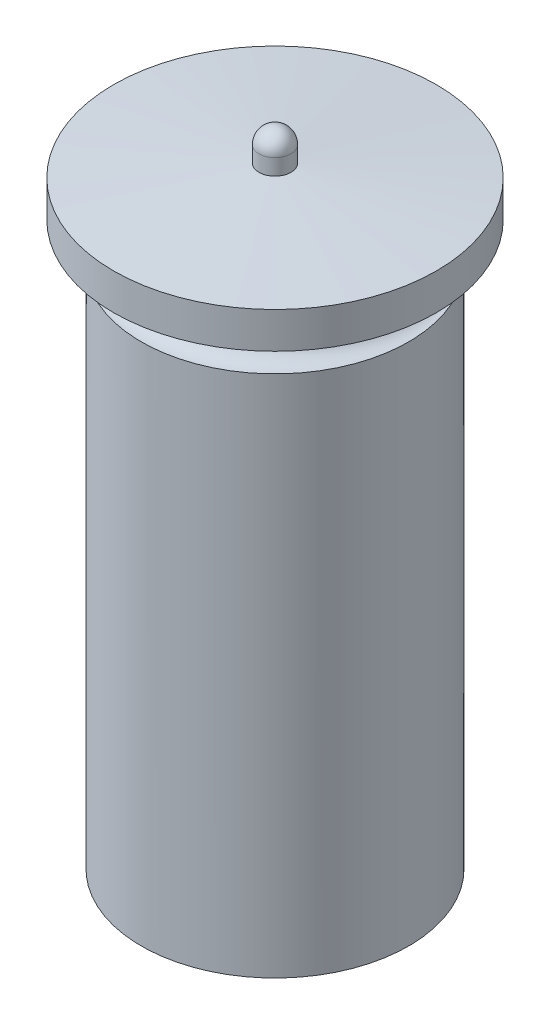
ISO-10303-21;
HEADER;
FILE_DESCRIPTION(('STEP AP214'),'2;1');
FILE_NAME('part.step','',(''),(''),'','','');
FILE_SCHEMA(('AUTOMOTIVE_DESIGN { 1 0 10303 214 1 1 1 1 }'));
ENDSEC;
DATA;
#1=APPLICATION_CONTEXT('core data for automotive mechanical design processes');
#2=APPLICATION_PROTOCOL_DEFINITION('international standard','automotive_design',2000,#1);
#3=PRODUCT_CONTEXT('',#1,'mechanical');
#4=PRODUCT('Part','Part','',(#3));
#5=PRODUCT_RELATED_PRODUCT_CATEGORY('part','',(#4));
#6=PRODUCT_DEFINITION_FORMATION('','',#4);
#7=PRODUCT_DEFINITION_CONTEXT('part definition',#1,'design');
#8=PRODUCT_DEFINITION('design','',#6,#7);
#9=PRODUCT_DEFINITION_SHAPE('','',#8);
#10=(LENGTH_UNIT() NAMED_UNIT(*) SI_UNIT(.MILLI.,.METRE.));
#11=(NAMED_UNIT(*) PLANE_ANGLE_UNIT() SI_UNIT($,.RADIAN.));
#12=(NAMED_UNIT(*) SI_UNIT($,.STERADIAN.) SOLID_ANGLE_UNIT());
#13=UNCERTAINTY_MEASURE_WITH_UNIT(LENGTH_MEASURE(1.E-05),#10,'distance_accuracy_value','');
#14=(GEOMETRIC_REPRESENTATION_CONTEXT(3) GLOBAL_UNCERTAINTY_ASSIGNED_CONTEXT((#13)) GLOBAL_UNIT_ASSIGNED_CONTEXT((#10,
#11,#12)) REPRESENTATION_CONTEXT('',''));
#15=CARTESIAN_POINT('',(0.,0.,0.));
#16=DIRECTION('',(0.,0.,1.));
#17=DIRECTION('',(1.,0.,0.));
#18=AXIS2_PLACEMENT_3D('',#15,#16,#17);
#19=CARTESIAN_POINT('',(0.,-9.326873172579,-69.85));
#20=DIRECTION('',(0.,1.,0.));
#21=DIRECTION('',(0.,0.,1.));
#22=AXIS2_PLACEMENT_3D('',#19,#20,#21);
#23=CYLINDRICAL_SURFACE('',#22,1.778);
#24=CARTESIAN_POINT('',(0.,-0.563873172579474,-69.85));
#25=DIRECTION('',(0.,1.,0.));
#26=DIRECTION('',(-1.,0.,0.));
#27=AXIS2_PLACEMENT_3D('',#24,#25,#26);
#28=CIRCLE('',#27,1.778);
#29=CARTESIAN_POINT('',(-1.778,-0.563873172579475,-69.85));
#30=VERTEX_POINT('',#29);
#31=EDGE_CURVE('P0_E10',#30,#30,#28,.T.);
#32=ORIENTED_EDGE('',*,*,#31,.T.);
#33=EDGE_LOOP('',(#32));
#34=FACE_BOUND('',#33,.T.);
#35=CARTESIAN_POINT('',(0.,-9.326873172579,-69.85));
#36=DIRECTION('',(0.,1.,0.));
#37=DIRECTION('',(-1.,0.,0.));
#38=AXIS2_PLACEMENT_3D('',#35,#36,#37);
#39=CIRCLE('',#38,1.778);
#40=CARTESIAN_POINT('',(-1.778,-9.326873172579,-69.85));
#41=VERTEX_POINT('',#40);
#42=EDGE_CURVE('P0_E15',#41,#41,#39,.F.);
#43=ORIENTED_EDGE('',*,*,#42,.T.);
#44=EDGE_LOOP('',(#43));
#45=FACE_BOUND('',#44,.T.);
#46=ADVANCED_FACE('P0_F14',(#34,#45),#23,.F.);
#47=OPEN_SHELL('',(#46));
#48=SHELL_BASED_SURFACE_MODEL('P0_B1',(#47));
#49=CARTESIAN_POINT('',(0.,0.4481268274208,-69.85));
#50=DIRECTION('',(0.,1.,0.));
#51=DIRECTION('',(-1.,0.,0.));
#52=AXIS2_PLACEMENT_3D('',#49,#50,#51);
#53=SPHERICAL_SURFACE('',#52,0.25);
#54=CARTESIAN_POINT('',(0.,0.6981268274208,-69.85));
#55=VERTEX_POINT('',#54);
#56=VERTEX_LOOP('',#55);
#57=FACE_BOUND('',#56,.T.);
#58=CARTESIAN_POINT('',(0.,0.448126827420864,-69.85));
#59=DIRECTION('',(0.,1.,0.));
#60=DIRECTION('',(1.,0.,0.));
#61=AXIS2_PLACEMENT_3D('',#58,#59,#60);
#62=CIRCLE('',#61,0.25);
#63=CARTESIAN_POINT('',(0.25,0.448126827420864,-69.85));
#64=VERTEX_POINT('',#63);
#65=EDGE_CURVE('P1_E48',#64,#64,#62,.T.);
#66=ORIENTED_EDGE('',*,*,#65,.T.);
#67=EDGE_LOOP('',(#66));
#68=FACE_BOUND('',#67,.T.);
#69=ADVANCED_FACE('P1_F16',(#57,#68),#53,.T.);
#70=CARTESIAN_POINT('',(0.,0.198126827420844,-69.85));
#71=DIRECTION('',(0.,1.,0.));
#72=DIRECTION('',(0.,0.,1.));
#73=AXIS2_PLACEMENT_3D('',#70,#71,#72);
#74=CYLINDRICAL_SURFACE('',#73,0.25);
#75=ORIENTED_EDGE('',*,*,#65,.F.);
#76=EDGE_LOOP('',(#75));
#77=FACE_BOUND('',#76,.T.);
#78=CARTESIAN_POINT('',(0.,0.198126827420778,-69.85));
#79=DIRECTION('',(0.,1.,0.));
#80=DIRECTION('',(1.,0.,0.));
#81=AXIS2_PLACEMENT_3D('',#78,#79,#80);
#82=CIRCLE('',#81,0.250000000000072);
#83=CARTESIAN_POINT('',(0.,0.198126827420778,-70.1000000000001));
#84=VERTEX_POINT('',#83);
#85=EDGE_CURVE('P1_E50',#84,#84,#82,.T.);
#86=ORIENTED_EDGE('',*,*,#85,.T.);
#87=EDGE_LOOP('',(#86));
#88=FACE_BOUND('',#87,.T.);
#89=ADVANCED_FACE('P1_F44',(#77,#88),#74,.T.);
#90=CARTESIAN_POINT('',(0.,0.,-69.85));
#91=DIRECTION('',(0.,-1.,0.));
#92=DIRECTION('',(0.,0.,-1.));
#93=AXIS2_PLACEMENT_3D('',#90,#91,#92);
#94=CONICAL_SURFACE('',#93,2.5146,1.48352986419519);
#95=CARTESIAN_POINT('',(0.,0.,-69.85));
#96=DIRECTION('',(0.,1.,0.));
#97=DIRECTION('',(1.,0.,0.));
#98=AXIS2_PLACEMENT_3D('',#95,#96,#97);
#99=CIRCLE('',#98,2.5146);
#100=CARTESIAN_POINT('',(0.,0.,-72.3646000000001));
#101=VERTEX_POINT('',#100);
#102=EDGE_CURVE('P1_E53',#101,#101,#99,.T.);
#103=CARTESIAN_POINT('',(0.,0.198126827420778,-70.1000000000001));
#104=CARTESIAN_POINT('',(0.,0.196063006301812,-70.1235895833334));
#105=CARTESIAN_POINT('',(0.,0.193999185182845,-70.1471791666668));
#106=CARTESIAN_POINT('',(0.,0.189871542944912,-70.1943583333334));
#107=CARTESIAN_POINT('',(0.,0.187807721825945,-70.2179479166667));
#108=CARTESIAN_POINT('',(0.,0.183680079588012,-70.2651270833334));
#109=CARTESIAN_POINT('',(0.,0.181616258469046,-70.2887166666667));
#110=CARTESIAN_POINT('',(0.,0.177488616231113,-70.3358958333334));
#111=CARTESIAN_POINT('',(0.,0.175424795112147,-70.3594854166668));
#112=CARTESIAN_POINT('',(0.,0.171297152874214,-70.4066645833334));
#113=CARTESIAN_POINT('',(0.,0.169233331755247,-70.4302541666667));
#114=CARTESIAN_POINT('',(0.,0.165105689517314,-70.4774333333334));
#115=CARTESIAN_POINT('',(0.,0.163041868398348,-70.5010229166668));
#116=CARTESIAN_POINT('',(0.,0.158914226160415,-70.5482020833334));
#117=CARTESIAN_POINT('',(0.,0.156850405041448,-70.5717916666667));
#118=CARTESIAN_POINT('',(0.,0.152722762803515,-70.6189708333334));
#119=CARTESIAN_POINT('',(0.,0.150658941684548,-70.6425604166668));
#120=CARTESIAN_POINT('',(0.,0.146531299446616,-70.6897395833334));
#121=CARTESIAN_POINT('',(0.,0.144467478327649,-70.7133291666668));
#122=CARTESIAN_POINT('',(0.,0.140339836089716,-70.7605083333334));
#123=CARTESIAN_POINT('',(0.,0.138276014970749,-70.7840979166668));
#124=CARTESIAN_POINT('',(0.,0.134148372732816,-70.8312770833334));
#125=CARTESIAN_POINT('',(0.,0.13208455161385,-70.8548666666668));
#126=CARTESIAN_POINT('',(0.,0.127956909375917,-70.9020458333334));
#127=CARTESIAN_POINT('',(0.,0.12589308825695,-70.9256354166668));
#128=CARTESIAN_POINT('',(0.,0.121765446019017,-70.9728145833334));
#129=CARTESIAN_POINT('',(0.,0.119701624900051,-70.9964041666667));
#130=CARTESIAN_POINT('',(0.,0.115573982662118,-71.0435833333334));
#131=CARTESIAN_POINT('',(0.,0.113510161543152,-71.0671729166667));
#132=CARTESIAN_POINT('',(0.,0.109382519305219,-71.1143520833334));
#133=CARTESIAN_POINT('',(0.,0.107318698186252,-71.1379416666667));
#134=CARTESIAN_POINT('',(0.,0.103191055948319,-71.1851208333334));
#135=CARTESIAN_POINT('',(0.,0.101127234829353,-71.2087104166667));
#136=CARTESIAN_POINT('',(0.,0.0969995925914196,-71.2558895833334));
#137=CARTESIAN_POINT('',(0.,0.0949357714724528,-71.2794791666667));
#138=CARTESIAN_POINT('',(0.,0.0908081292345196,-71.3266583333334));
#139=CARTESIAN_POINT('',(0.,0.0887443081155532,-71.3502479166667));
#140=CARTESIAN_POINT('',(0.,0.0846166658776205,-71.3974270833334));
#141=CARTESIAN_POINT('',(0.,0.0825528447586542,-71.4210166666668));
#142=CARTESIAN_POINT('',(0.,0.078425202520721,-71.4681958333334));
#143=CARTESIAN_POINT('',(0.,0.0763613814017541,-71.4917854166667));
#144=CARTESIAN_POINT('',(0.,0.0722337391638212,-71.5389645833334));
#145=CARTESIAN_POINT('',(0.,0.0701699180448551,-71.5625541666668));
#146=CARTESIAN_POINT('',(0.,0.0660422758069221,-71.6097333333334));
#147=CARTESIAN_POINT('',(0.,0.0639784546879553,-71.6333229166667));
#148=CARTESIAN_POINT('',(0.,0.0598508124500221,-71.6805020833334));
#149=CARTESIAN_POINT('',(0.,0.0577869913310557,-71.7040916666667));
#150=CARTESIAN_POINT('',(0.,0.053659349093123,-71.7512708333334));
#151=CARTESIAN_POINT('',(0.,0.0515955279741567,-71.7748604166668));
#152=CARTESIAN_POINT('',(0.,0.0474678857362235,-71.8220395833334));
#153=CARTESIAN_POINT('',(0.,0.0454040646172566,-71.8456291666667));
#154=CARTESIAN_POINT('',(0.,0.0412764223793237,-71.8928083333334));
#155=CARTESIAN_POINT('',(0.,0.0392126012603575,-71.9163979166668));
#156=CARTESIAN_POINT('',(0.,0.0350849590224246,-71.9635770833334));
#157=CARTESIAN_POINT('',(0.,0.0330211379034577,-71.9871666666667));
#158=CARTESIAN_POINT('',(0.,0.0288934956655245,-72.0343458333334));
#159=CARTESIAN_POINT('',(0.,0.0268296745465582,-72.0579354166668));
#160=CARTESIAN_POINT('',(0.,0.0227020323086255,-72.1051145833334));
#161=CARTESIAN_POINT('',(0.,0.0206382111896591,-72.1287041666668));
#162=CARTESIAN_POINT('',(0.,0.016510568951726,-72.1758833333334));
#163=CARTESIAN_POINT('',(0.,0.0144467478327592,-72.1994729166667));
#164=CARTESIAN_POINT('',(0.,0.0103191055948261,-72.2466520833334));
#165=CARTESIAN_POINT('',(0.,0.00825528447585981,-72.2702416666667));
#166=CARTESIAN_POINT('',(0.,0.00412764223792725,-72.3174208333334));
#167=CARTESIAN_POINT('',(0.,0.00206382111896097,-72.3410104166667));
#168=CARTESIAN_POINT('',(0.,0.,-72.3646000000001));
#169=B_SPLINE_CURVE_WITH_KNOTS('',3,(#103,#104,#105,#106,#107,#108,#109,#110,#111,#112,#113,
#114,#115,#116,#117,#118,#119,#120,#121,#122,#123,#124,#125,#126,#127,#128,#129,#130,#131,#132,
#133,#134,#135,#136,#137,#138,#139,#140,#141,#142,#143,#144,#145,#146,#147,#148,#149,#150,#151,
#152,#153,#154,#155,#156,#157,#158,#159,#160,#161,#162,#163,#164,#165,#166,#167,#168),
.UNSPECIFIED.,.F.,.F.,(4,2,2,2,2,2,2,2,2,2,2,2,2,2,2,2,2,2,2,2,2,2,2,2,2,2,2,2,2,2,2,2,4),(0.,
0.0710390751281511,0.142078150256288,0.213117225384439,0.28415630051259,0.355195375640728,
0.426234450768879,0.497273525897016,0.568312601025167,0.639351676153318,0.710390751281455,
0.781429826409606,0.852468901537744,0.923507976665895,0.994547051794046,1.06558612692218,
1.13662520205033,1.20766427717847,1.27870335230662,1.34974242743477,1.42078150256291,
1.49182057769106,1.5628596528192,1.63389872794735,1.7049378030755,1.77597687820364,
1.84701595333179,1.91805502845993,1.98909410358808,2.06013317871623,2.13117225384437,
2.20221132897252,2.27325040410065),.UNSPECIFIED.);
#170=EDGE_CURVE('P1_BSEAM135',#84,#101,#169,.T.);
#171=ORIENTED_EDGE('',*,*,#85,.F.);
#172=ORIENTED_EDGE('',*,*,#102,.T.);
#173=ORIENTED_EDGE('',*,*,#170,.T.);
#174=ORIENTED_EDGE('',*,*,#170,.F.);
#175=EDGE_LOOP('',(#171,#173,#172,#174));
#176=FACE_BOUND('',#175,.T.);
#177=ADVANCED_FACE('P1_F135',(#176),#94,.T.);
#178=CARTESIAN_POINT('',(0.,-0.56387317257916,-69.85));
#179=DIRECTION('',(0.,1.,0.));
#180=DIRECTION('',(0.,0.,1.));
#181=AXIS2_PLACEMENT_3D('',#178,#179,#180);
#182=CYLINDRICAL_SURFACE('',#181,2.5146);
#183=ORIENTED_EDGE('',*,*,#102,.F.);
#184=EDGE_LOOP('',(#183));
#185=FACE_BOUND('',#184,.T.);
#186=CARTESIAN_POINT('',(0.,-0.56387317257916,-69.85));
#187=DIRECTION('',(0.,1.,0.));
#188=DIRECTION('',(0.,0.,1.));
#189=AXIS2_PLACEMENT_3D('',#186,#187,#188);
#190=CIRCLE('',#189,2.5146);
#191=CARTESIAN_POINT('',(0.,-0.56387317257916,-67.3354));
#192=VERTEX_POINT('',#191);
#193=EDGE_CURVE('P1_E81',#192,#192,#190,.T.);
#194=ORIENTED_EDGE('',*,*,#193,.T.);
#195=EDGE_LOOP('',(#194));
#196=FACE_BOUND('',#195,.T.);
#197=ADVANCED_FACE('P1_F66',(#185,#196),#182,.T.);
#198=CARTESIAN_POINT('',(-2.615184,-0.5638731725792,-67.234816));
#199=DIRECTION('',(0.,1.,0.));
#200=DIRECTION('',(1.,0.,0.));
#201=AXIS2_PLACEMENT_3D('',#198,#199,#200);
#202=PLANE('',#201);
#203=CARTESIAN_POINT('',(0.,-0.5638731725792,-69.85));
#204=DIRECTION('',(0.,-1.,0.));
#205=DIRECTION('',(-1.,0.,0.));
#206=AXIS2_PLACEMENT_3D('',#203,#204,#205);
#207=CIRCLE('',#206,2.08280000000013);
#208=CARTESIAN_POINT('',(-2.08280000000006,-0.5638731725792,-69.85));
#209=VERTEX_POINT('',#208);
#210=CARTESIAN_POINT('',(2.08280000000006,-0.5638731725792,-69.8499999999998));
#211=VERTEX_POINT('',#210);
#212=EDGE_CURVE('P1_E35',#209,#211,#207,.T.);
#213=ORIENTED_EDGE('',*,*,#212,.F.);
#214=CARTESIAN_POINT('',(0.,-0.5638731725792,-69.85));
#215=DIRECTION('',(0.,-1.,0.));
#216=DIRECTION('',(1.,0.,2.06554360496554E-13));
#217=AXIS2_PLACEMENT_3D('',#214,#215,#216);
#218=CIRCLE('',#217,2.08280000000013);
#219=EDGE_CURVE('P1_E39',#211,#209,#218,.T.);
#220=ORIENTED_EDGE('',*,*,#219,.F.);
#221=EDGE_LOOP('',(#213,#220));
#222=FACE_BOUND('',#221,.T.);
#223=ORIENTED_EDGE('',*,*,#193,.F.);
#224=EDGE_LOOP('',(#223));
#225=FACE_BOUND('',#224,.T.);
#226=ADVANCED_FACE('P1_F62',(#222,#225),#202,.F.);
#227=CARTESIAN_POINT('',(0.,-0.8686731725792,-69.85));
#228=DIRECTION('',(0.,-1.,0.));
#229=DIRECTION('',(-1.,0.,0.));
#230=AXIS2_PLACEMENT_3D('',#227,#228,#229);
#231=TOROIDAL_SURFACE('',#230,2.0828,0.3048);
#232=ORIENTED_EDGE('',*,*,#219,.T.);
#233=ORIENTED_EDGE('',*,*,#212,.T.);
#234=EDGE_LOOP('',(#232,#233));
#235=FACE_BOUND('',#234,.T.);
#236=CARTESIAN_POINT('',(0.,-1.17347317257901,-69.85));
#237=DIRECTION('',(0.,-1.,0.));
#238=DIRECTION('',(-1.,0.,0.));
#239=AXIS2_PLACEMENT_3D('',#236,#237,#238);
#240=CIRCLE('',#239,2.0828);
#241=CARTESIAN_POINT('',(-2.0828,-1.17347317257901,-69.85));
#242=VERTEX_POINT('',#241);
#243=EDGE_CURVE('P1_E28',#242,#242,#240,.F.);
#244=ORIENTED_EDGE('',*,*,#243,.T.);
#245=EDGE_LOOP('',(#244));
#246=FACE_BOUND('',#245,.T.);
#247=ADVANCED_FACE('P1_F65',(#235,#246),#231,.F.);
#248=CARTESIAN_POINT('',(2.166112,-9.326873172579,-67.683888));
#249=DIRECTION('',(0.,-1.,0.));
#250=DIRECTION('',(-1.,0.,0.));
#251=AXIS2_PLACEMENT_3D('',#248,#249,#250);
#252=PLANE('',#251);
#253=CARTESIAN_POINT('',(0.,-9.32687317257874,-69.85));
#254=DIRECTION('',(0.,-1.,0.));
#255=DIRECTION('',(0.,0.,-1.));
#256=AXIS2_PLACEMENT_3D('',#253,#254,#255);
#257=CIRCLE('',#256,2.0828);
#258=CARTESIAN_POINT('',(0.,-9.32687317257874,-71.9328));
#259=VERTEX_POINT('',#258);
#260=EDGE_CURVE('P1_E11',#259,#259,#257,.T.);
#261=ORIENTED_EDGE('',*,*,#260,.T.);
#262=EDGE_LOOP('',(#261));
#263=FACE_BOUND('',#262,.T.);
#264=ADVANCED_FACE('P1_F18',(#263),#252,.T.);
#265=CARTESIAN_POINT('',(0.,-1.17347317257901,-69.85));
#266=DIRECTION('',(0.,-1.,0.));
#267=DIRECTION('',(0.,0.,-1.));
#268=AXIS2_PLACEMENT_3D('',#265,#266,#267);
#269=CYLINDRICAL_SURFACE('',#268,2.0828);
#270=ORIENTED_EDGE('',*,*,#260,.F.);
#271=EDGE_LOOP('',(#270));
#272=FACE_BOUND('',#271,.T.);
#273=ORIENTED_EDGE('',*,*,#243,.F.);
#274=EDGE_LOOP('',(#273));
#275=FACE_BOUND('',#274,.T.);
#276=ADVANCED_FACE('P1_F101',(#272,#275),#269,.T.);
#277=CLOSED_SHELL('',(#69,#89,#177,#197,#226,#247,#264,#276));
#278=MANIFOLD_SOLID_BREP('P1_B1',#277);
#279=ADVANCED_BREP_SHAPE_REPRESENTATION('',(#18,#278),#14);
#280=MANIFOLD_SURFACE_SHAPE_REPRESENTATION('',(#18,#48),#14);
#281=SHAPE_REPRESENTATION('',(#18),#14);
#282=SHAPE_DEFINITION_REPRESENTATION(#9,#281);
#283=SHAPE_REPRESENTATION_RELATIONSHIP('','',#281,#279);
#284=SHAPE_REPRESENTATION_RELATIONSHIP('','',#281,#280);
ENDSEC;
END-ISO-10303-21;
